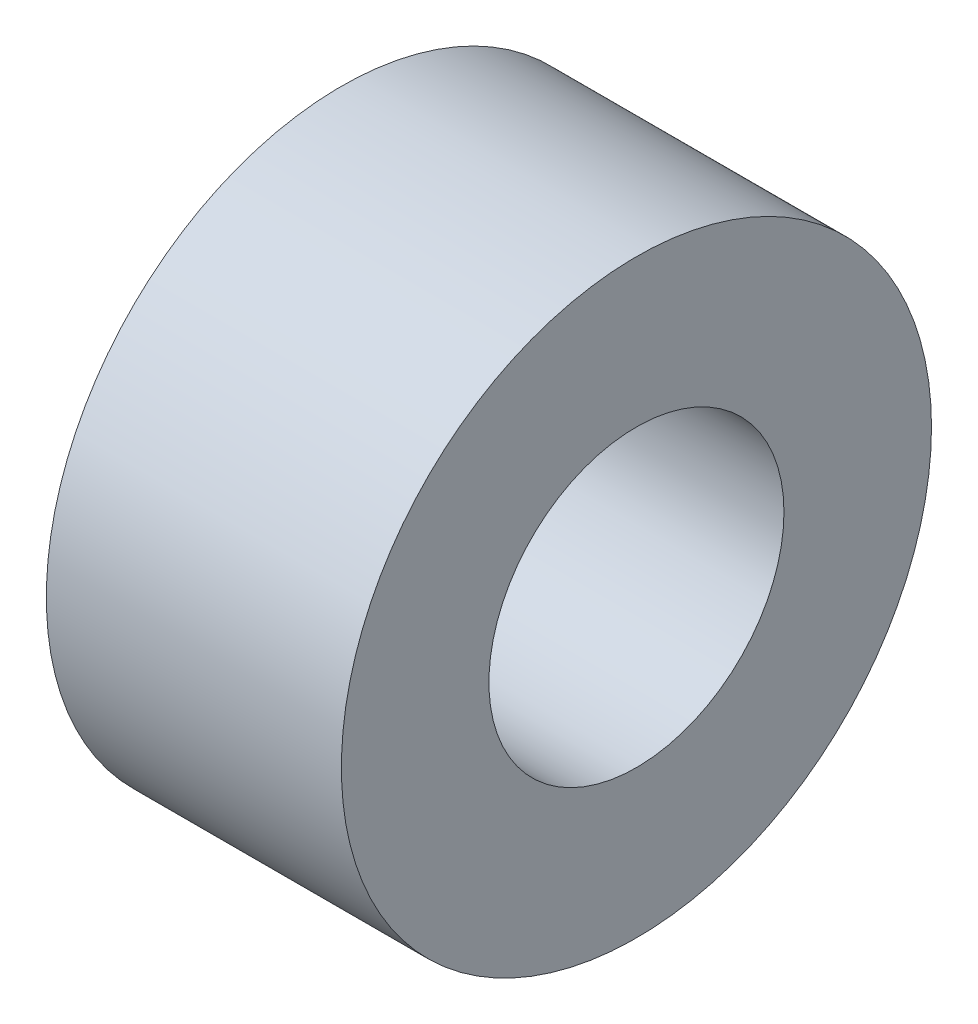
ISO-10303-21;
HEADER;
FILE_DESCRIPTION(('STEP AP214'),'2;1');
FILE_NAME('part.step','',(''),(''),'','','');
FILE_SCHEMA(('AUTOMOTIVE_DESIGN { 1 0 10303 214 1 1 1 1 }'));
ENDSEC;
DATA;
#1=APPLICATION_CONTEXT('core data for automotive mechanical design processes');
#2=APPLICATION_PROTOCOL_DEFINITION('international standard','automotive_design',2000,#1);
#3=PRODUCT_CONTEXT('',#1,'mechanical');
#4=PRODUCT('Part','Part','',(#3));
#5=PRODUCT_RELATED_PRODUCT_CATEGORY('part','',(#4));
#6=PRODUCT_DEFINITION_FORMATION('','',#4);
#7=PRODUCT_DEFINITION_CONTEXT('part definition',#1,'design');
#8=PRODUCT_DEFINITION('design','',#6,#7);
#9=PRODUCT_DEFINITION_SHAPE('','',#8);
#10=(LENGTH_UNIT() NAMED_UNIT(*) SI_UNIT(.MILLI.,.METRE.));
#11=(NAMED_UNIT(*) PLANE_ANGLE_UNIT() SI_UNIT($,.RADIAN.));
#12=(NAMED_UNIT(*) SI_UNIT($,.STERADIAN.) SOLID_ANGLE_UNIT());
#13=UNCERTAINTY_MEASURE_WITH_UNIT(LENGTH_MEASURE(1.E-05),#10,'distance_accuracy_value','');
#14=(GEOMETRIC_REPRESENTATION_CONTEXT(3) GLOBAL_UNCERTAINTY_ASSIGNED_CONTEXT((#13)) GLOBAL_UNIT_ASSIGNED_CONTEXT((#10,
#11,#12)) REPRESENTATION_CONTEXT('',''));
#15=CARTESIAN_POINT('',(0.,0.,0.));
#16=DIRECTION('',(0.,0.,1.));
#17=DIRECTION('',(1.,0.,0.));
#18=AXIS2_PLACEMENT_3D('',#15,#16,#17);
#19=CARTESIAN_POINT('',(6.35,0.,0.));
#20=DIRECTION('',(1.,0.,0.));
#21=DIRECTION('',(0.,0.,-1.));
#22=AXIS2_PLACEMENT_3D('',#19,#20,#21);
#23=PLANE('',#22);
#24=CARTESIAN_POINT('',(6.35,0.,0.));
#25=DIRECTION('',(1.,0.,0.));
#26=DIRECTION('',(0.,0.,-1.));
#27=AXIS2_PLACEMENT_3D('',#24,#25,#26);
#28=CIRCLE('',#27,6.35);
#29=CARTESIAN_POINT('',(6.35,0.,-6.35));
#30=VERTEX_POINT('',#29);
#31=EDGE_CURVE('E10',#30,#30,#28,.T.);
#32=ORIENTED_EDGE('',*,*,#31,.T.);
#33=EDGE_LOOP('',(#32));
#34=FACE_BOUND('',#33,.T.);
#35=CARTESIAN_POINT('',(6.35,0.,0.));
#36=DIRECTION('',(1.,0.,0.));
#37=DIRECTION('',(0.,0.,-1.));
#38=AXIS2_PLACEMENT_3D('',#35,#36,#37);
#39=CIRCLE('',#38,3.175);
#40=CARTESIAN_POINT('',(6.35,0.,-3.175));
#41=VERTEX_POINT('',#40);
#42=EDGE_CURVE('E57',#41,#41,#39,.T.);
#43=ORIENTED_EDGE('',*,*,#42,.F.);
#44=EDGE_LOOP('',(#43));
#45=FACE_BOUND('',#44,.T.);
#46=ADVANCED_FACE('F43',(#34,#45),#23,.T.);
#47=CARTESIAN_POINT('',(0.,0.,0.));
#48=DIRECTION('',(1.,0.,0.));
#49=DIRECTION('',(0.,0.,-1.));
#50=AXIS2_PLACEMENT_3D('',#47,#48,#49);
#51=PLANE('',#50);
#52=CARTESIAN_POINT('',(0.,0.,0.));
#53=DIRECTION('',(1.,0.,0.));
#54=DIRECTION('',(0.,0.,-1.));
#55=AXIS2_PLACEMENT_3D('',#52,#53,#54);
#56=CIRCLE('',#55,6.35);
#57=CARTESIAN_POINT('',(0.,0.,-6.35));
#58=VERTEX_POINT('',#57);
#59=EDGE_CURVE('E50',#58,#58,#56,.T.);
#60=ORIENTED_EDGE('',*,*,#59,.F.);
#61=EDGE_LOOP('',(#60));
#62=FACE_BOUND('',#61,.T.);
#63=CARTESIAN_POINT('',(0.,0.,0.));
#64=DIRECTION('',(1.,0.,0.));
#65=DIRECTION('',(0.,0.,-1.));
#66=AXIS2_PLACEMENT_3D('',#63,#64,#65);
#67=CIRCLE('',#66,3.175);
#68=CARTESIAN_POINT('',(0.,0.,-3.175));
#69=VERTEX_POINT('',#68);
#70=EDGE_CURVE('E59',#69,#69,#67,.T.);
#71=ORIENTED_EDGE('',*,*,#70,.T.);
#72=EDGE_LOOP('',(#71));
#73=FACE_BOUND('',#72,.T.);
#74=ADVANCED_FACE('F66',(#62,#73),#51,.F.);
#75=CARTESIAN_POINT('',(6.35,0.,0.));
#76=DIRECTION('',(-1.,0.,0.));
#77=DIRECTION('',(0.,0.,1.));
#78=AXIS2_PLACEMENT_3D('',#75,#76,#77);
#79=CYLINDRICAL_SURFACE('',#78,6.35);
#80=ORIENTED_EDGE('',*,*,#31,.F.);
#81=EDGE_LOOP('',(#80));
#82=FACE_BOUND('',#81,.T.);
#83=ORIENTED_EDGE('',*,*,#59,.T.);
#84=EDGE_LOOP('',(#83));
#85=FACE_BOUND('',#84,.T.);
#86=ADVANCED_FACE('F44',(#82,#85),#79,.T.);
#87=CARTESIAN_POINT('',(6.35,0.,0.));
#88=DIRECTION('',(-1.,0.,0.));
#89=DIRECTION('',(0.,0.,1.));
#90=AXIS2_PLACEMENT_3D('',#87,#88,#89);
#91=CYLINDRICAL_SURFACE('',#90,3.175);
#92=ORIENTED_EDGE('',*,*,#42,.T.);
#93=EDGE_LOOP('',(#92));
#94=FACE_BOUND('',#93,.T.);
#95=ORIENTED_EDGE('',*,*,#70,.F.);
#96=EDGE_LOOP('',(#95));
#97=FACE_BOUND('',#96,.T.);
#98=ADVANCED_FACE('F67',(#94,#97),#91,.F.);
#99=CLOSED_SHELL('',(#46,#74,#86,#98));
#100=MANIFOLD_SOLID_BREP('B2',#99);
#101=ADVANCED_BREP_SHAPE_REPRESENTATION('',(#18,#100),#14);
#102=SHAPE_DEFINITION_REPRESENTATION(#9,#101);
ENDSEC;
END-ISO-10303-21;
